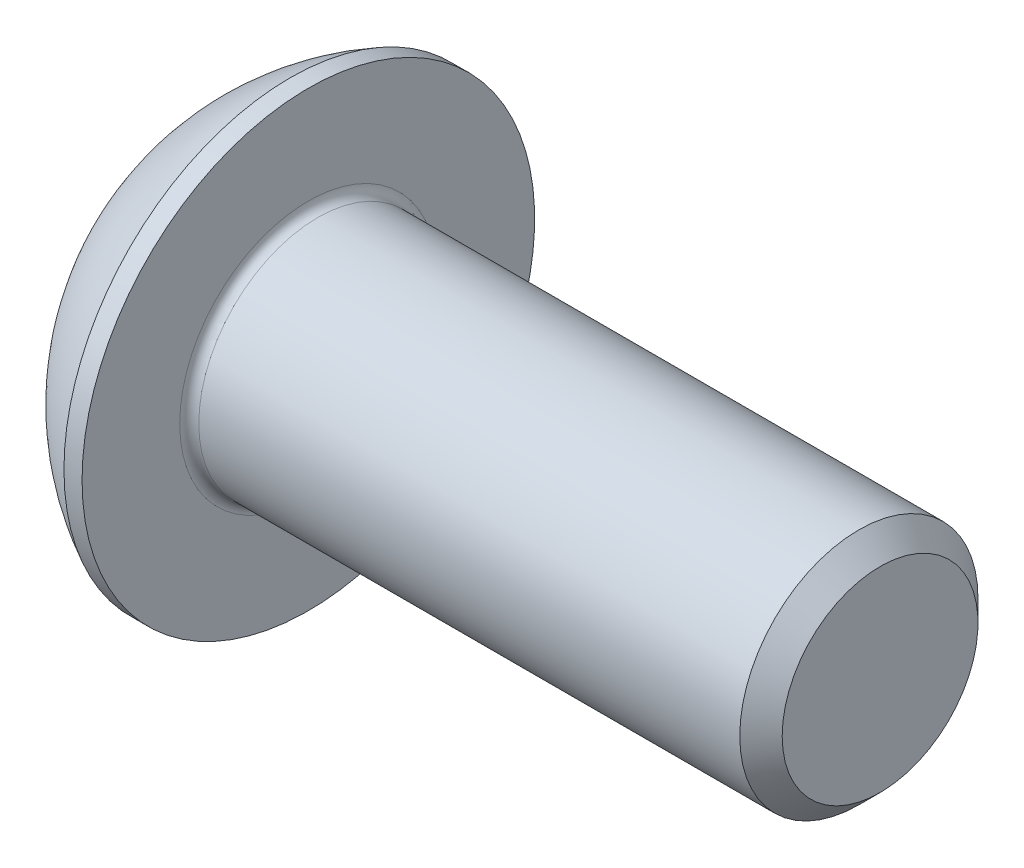
ISO-10303-21;
HEADER;
FILE_DESCRIPTION(('STEP AP214'),'2;1');
FILE_NAME('part.step','',(''),(''),'','','');
FILE_SCHEMA(('AUTOMOTIVE_DESIGN { 1 0 10303 214 1 1 1 1 }'));
ENDSEC;
DATA;
#1=APPLICATION_CONTEXT('core data for automotive mechanical design processes');
#2=APPLICATION_PROTOCOL_DEFINITION('international standard','automotive_design',2000,#1);
#3=PRODUCT_CONTEXT('',#1,'mechanical');
#4=PRODUCT('Part','Part','',(#3));
#5=PRODUCT_RELATED_PRODUCT_CATEGORY('part','',(#4));
#6=PRODUCT_DEFINITION_FORMATION('','',#4);
#7=PRODUCT_DEFINITION_CONTEXT('part definition',#1,'design');
#8=PRODUCT_DEFINITION('design','',#6,#7);
#9=PRODUCT_DEFINITION_SHAPE('','',#8);
#10=(LENGTH_UNIT() NAMED_UNIT(*) SI_UNIT(.MILLI.,.METRE.));
#11=(NAMED_UNIT(*) PLANE_ANGLE_UNIT() SI_UNIT($,.RADIAN.));
#12=(NAMED_UNIT(*) SI_UNIT($,.STERADIAN.) SOLID_ANGLE_UNIT());
#13=UNCERTAINTY_MEASURE_WITH_UNIT(LENGTH_MEASURE(1.E-05),#10,'distance_accuracy_value','');
#14=(GEOMETRIC_REPRESENTATION_CONTEXT(3) GLOBAL_UNCERTAINTY_ASSIGNED_CONTEXT((#13)) GLOBAL_UNIT_ASSIGNED_CONTEXT((#10,
#11,#12)) REPRESENTATION_CONTEXT('',''));
#15=CARTESIAN_POINT('',(0.,0.,0.));
#16=DIRECTION('',(0.,0.,1.));
#17=DIRECTION('',(1.,0.,0.));
#18=AXIS2_PLACEMENT_3D('',#15,#16,#17);
#19=CARTESIAN_POINT('',(0.,0.,0.));
#20=DIRECTION('',(-1.,0.,0.));
#21=DIRECTION('',(0.,0.,1.));
#22=AXIS2_PLACEMENT_3D('',#19,#20,#21);
#23=PLANE('',#22);
#24=CARTESIAN_POINT('',(0.,0.,0.));
#25=DIRECTION('',(-1.,0.,0.));
#26=DIRECTION('',(0.,0.,1.));
#27=AXIS2_PLACEMENT_3D('',#24,#25,#26);
#28=CIRCLE('',#27,2.375);
#29=CARTESIAN_POINT('',(0.,2.375,0.));
#30=VERTEX_POINT('',#29);
#31=EDGE_CURVE('E157',#30,#30,#28,.T.);
#32=ORIENTED_EDGE('',*,*,#31,.T.);
#33=EDGE_LOOP('',(#32));
#34=FACE_BOUND('',#33,.T.);
#35=DIRECTION('',(0.,-1.,0.));
#36=VECTOR('',#35,1.);
#37=CARTESIAN_POINT('',(0.,-0.866025403784438,1.5));
#38=LINE('',#37,#36);
#39=CARTESIAN_POINT('',(0.,0.866025403784439,1.5));
#40=VERTEX_POINT('',#39);
#41=CARTESIAN_POINT('',(0.,-0.866025403784438,1.5));
#42=VERTEX_POINT('',#41);
#43=EDGE_CURVE('E52',#40,#42,#38,.T.);
#44=ORIENTED_EDGE('',*,*,#43,.T.);
#45=DIRECTION('',(0.,-0.500000000000001,-0.866025403784438));
#46=VECTOR('',#45,1.);
#47=CARTESIAN_POINT('',(0.,-1.73205080756888,0.));
#48=LINE('',#47,#46);
#49=CARTESIAN_POINT('',(0.,-1.73205080756888,0.));
#50=VERTEX_POINT('',#49);
#51=EDGE_CURVE('E277',#42,#50,#48,.T.);
#52=ORIENTED_EDGE('',*,*,#51,.T.);
#53=DIRECTION('',(0.,0.500000000000001,-0.866025403784438));
#54=VECTOR('',#53,1.);
#55=CARTESIAN_POINT('',(0.,-0.866025403784438,-1.5));
#56=LINE('',#55,#54);
#57=CARTESIAN_POINT('',(0.,-0.866025403784438,-1.5));
#58=VERTEX_POINT('',#57);
#59=EDGE_CURVE('E132',#50,#58,#56,.T.);
#60=ORIENTED_EDGE('',*,*,#59,.T.);
#61=DIRECTION('',(0.,1.,0.));
#62=VECTOR('',#61,1.);
#63=CARTESIAN_POINT('',(0.,0.866025403784439,-1.5));
#64=LINE('',#63,#62);
#65=CARTESIAN_POINT('',(0.,0.866025403784439,-1.5));
#66=VERTEX_POINT('',#65);
#67=EDGE_CURVE('E280',#58,#66,#64,.T.);
#68=ORIENTED_EDGE('',*,*,#67,.T.);
#69=DIRECTION('',(0.,0.5,0.866025403784439));
#70=VECTOR('',#69,1.);
#71=CARTESIAN_POINT('',(0.,1.73205080756888,0.));
#72=LINE('',#71,#70);
#73=CARTESIAN_POINT('',(0.,1.73205080756888,0.));
#74=VERTEX_POINT('',#73);
#75=EDGE_CURVE('E282',#66,#74,#72,.T.);
#76=ORIENTED_EDGE('',*,*,#75,.T.);
#77=DIRECTION('',(0.,-0.5,0.866025403784439));
#78=VECTOR('',#77,1.);
#79=CARTESIAN_POINT('',(0.,0.866025403784439,1.5));
#80=LINE('',#79,#78);
#81=EDGE_CURVE('E284',#74,#40,#80,.T.);
#82=ORIENTED_EDGE('',*,*,#81,.T.);
#83=EDGE_LOOP('',(#44,#52,#60,#68,#76,#82));
#84=FACE_BOUND('',#83,.T.);
#85=ADVANCED_FACE('F37',(#34,#84),#23,.T.);
#86=CARTESIAN_POINT('',(4.75501582278481,0.,0.));
#87=DIRECTION('',(-1.,0.,0.));
#88=DIRECTION('',(0.,1.,0.));
#89=AXIS2_PLACEMENT_3D('',#86,#87,#88);
#90=SPHERICAL_SURFACE('',#89,5.3151482081814);
#91=CARTESIAN_POINT('',(2.37,0.,0.));
#92=DIRECTION('',(-1.,0.,0.));
#93=DIRECTION('',(0.,0.,1.));
#94=AXIS2_PLACEMENT_3D('',#91,#92,#93);
#95=CIRCLE('',#94,4.75);
#96=CARTESIAN_POINT('',(2.37,4.75,0.));
#97=VERTEX_POINT('',#96);
#98=EDGE_CURVE('E154',#97,#97,#95,.T.);
#99=CARTESIAN_POINT('',(2.37,4.75,0.));
#100=CARTESIAN_POINT('',(2.33822259048669,4.73404434732511,0.));
#101=CARTESIAN_POINT('',(2.30660534291523,4.71776971995817,0.));
#102=CARTESIAN_POINT('',(2.24370380094997,4.68458927158339,0.));
#103=CARTESIAN_POINT('',(2.21241950655618,4.66768345057555,0.));
#104=CARTESIAN_POINT('',(2.15019650024021,4.6332473706621,0.));
#105=CARTESIAN_POINT('',(2.11925778831804,4.6157171117565,0.));
#106=CARTESIAN_POINT('',(2.05773840110808,4.58003923142985,0.));
#107=CARTESIAN_POINT('',(2.02715772582028,4.56189161000879,0.));
#108=CARTESIAN_POINT('',(1.96636673145741,4.52498631044657,0.));
#109=CARTESIAN_POINT('',(1.93615641238234,4.50622863230542,0.));
#110=CARTESIAN_POINT('',(1.87611829826807,4.46811077571318,0.));
#111=CARTESIAN_POINT('',(1.84629050322887,4.4487505972621,0.));
#112=CARTESIAN_POINT('',(1.78702945162455,4.40943553782984,0.));
#113=CARTESIAN_POINT('',(1.75759619505941,4.38948065684866,0.));
#114=CARTESIAN_POINT('',(1.69913607574061,4.34898423002648,0.));
#115=CARTESIAN_POINT('',(1.67010921298694,4.32844268418549,0.));
#116=CARTESIAN_POINT('',(1.61247357298735,4.28678120152175,0.));
#117=CARTESIAN_POINT('',(1.58386479574144,4.265661264699,0.));
#118=CARTESIAN_POINT('',(1.52707685004032,4.22285150694424,0.));
#119=CARTESIAN_POINT('',(1.49889768158512,4.20116168601223,0.));
#120=CARTESIAN_POINT('',(1.44298030371049,4.15722089644741,0.));
#121=CARTESIAN_POINT('',(1.41524209429107,4.13496992781461,0.));
#122=CARTESIAN_POINT('',(1.36021780711889,4.08991580528235,0.));
#123=CARTESIAN_POINT('',(1.33293172936613,4.06711265138288,0.));
#124=CARTESIAN_POINT('',(1.278822696045,4.02096334316478,0.));
#125=CARTESIAN_POINT('',(1.25199974047662,3.99761718884614,0.));
#126=CARTESIAN_POINT('',(1.19882775550162,3.95039128335163,0.));
#127=CARTESIAN_POINT('',(1.172478726095,3.92651153217576,0.));
#128=CARTESIAN_POINT('',(1.1202652065289,3.87822805145535,0.));
#129=CARTESIAN_POINT('',(1.09440071636942,3.85382432191081,0.));
#130=CARTESIAN_POINT('',(1.04316669321618,3.8045027139941,0.));
#131=CARTESIAN_POINT('',(1.01779716022241,3.77958483562192,0.));
#132=CARTESIAN_POINT('',(0.9675632699561,3.72924496668416,0.));
#133=CARTESIAN_POINT('',(0.942698912683562,3.70382297611859,0.));
#134=CARTESIAN_POINT('',(0.893485388936279,3.65248512247887,0.));
#135=CARTESIAN_POINT('',(0.869136222461535,3.62656925940472,0.));
#136=CARTESIAN_POINT('',(0.820962887873489,3.57425409935885,0.));
#137=CARTESIAN_POINT('',(0.797138719760188,3.54785480238711,0.));
#138=CARTESIAN_POINT('',(0.750024977995378,3.49458340787865,0.));
#139=CARTESIAN_POINT('',(0.726735404343869,3.46771131034191,0.));
#140=CARTESIAN_POINT('',(0.68070023227454,3.41350513847464,0.));
#141=CARTESIAN_POINT('',(0.657954633856721,3.3861710641441,0.));
#142=CARTESIAN_POINT('',(0.613016573919582,3.33105194853939,0.));
#143=CARTESIAN_POINT('',(0.590824112400263,3.30326690726522,0.));
#144=CARTESIAN_POINT('',(0.547001265128254,3.24725704926748,0.));
#145=CARTESIAN_POINT('',(0.525370879375564,3.21903223254391,0.));
#146=CARTESIAN_POINT('',(0.482680896105488,3.16215419227902,0.));
#147=CARTESIAN_POINT('',(0.461621298588104,3.13350096873769,0.));
#148=CARTESIAN_POINT('',(0.420081374357153,3.07577765602273,0.));
#149=CARTESIAN_POINT('',(0.399601047643587,3.04670756684908,0.));
#150=CARTESIAN_POINT('',(0.359227914239947,2.98816223197683,0.));
#151=CARTESIAN_POINT('',(0.339335107549873,2.95868698627822,0.));
#152=CARTESIAN_POINT('',(0.300145026860787,2.89934321060632,0.));
#153=CARTESIAN_POINT('',(0.280847752861776,2.86947468063304,0.));
#154=CARTESIAN_POINT('',(0.24285650999714,2.80935636725696,0.));
#155=CARTESIAN_POINT('',(0.224162541131515,2.77910658385417,0.));
#156=CARTESIAN_POINT('',(0.187385439283607,2.71823794734018,0.));
#157=CARTESIAN_POINT('',(0.169302306301324,2.68761909422898,0.));
#158=CARTESIAN_POINT('',(0.133754156035988,2.626024653246,0.));
#159=CARTESIAN_POINT('',(0.116289138752934,2.59504906537422,0.));
#160=CARTESIAN_POINT('',(0.081984269005742,2.53275362391635,0.));
#161=CARTESIAN_POINT('',(0.0651444165416036,2.50143377033028,0.));
#162=CARTESIAN_POINT('',(0.0320966055444289,2.43846244094735,0.));
#163=CARTESIAN_POINT('',(0.0158886470113927,2.40681096515049,0.));
#164=CARTESIAN_POINT('',(0.,2.375,0.));
#165=B_SPLINE_CURVE_WITH_KNOTS('',3,(#99,#100,#101,#102,#103,#104,#105,#106,#107,#108,#109,#110,
#111,#112,#113,#114,#115,#116,#117,#118,#119,#120,#121,#122,#123,#124,#125,#126,#127,#128,#129,
#130,#131,#132,#133,#134,#135,#136,#137,#138,#139,#140,#141,#142,#143,#144,#145,#146,#147,#148,
#149,#150,#151,#152,#153,#154,#155,#156,#157,#158,#159,#160,#161,#162,#163,#164),.UNSPECIFIED.,
.F.,.F.,(4,2,2,2,2,2,2,2,2,2,2,2,2,2,2,2,2,2,2,2,2,2,2,2,2,2,2,2,2,2,2,2,4),(0.,
0.106672849678272,0.213345699356545,0.320018549034817,0.42669139871309,0.533364248391363,
0.640037098069635,0.746709947747908,0.85338279742618,0.960055647104452,1.06672849678273,
1.173401346461,1.28007419613927,1.38674704581754,1.49341989549582,1.60009274517409,
1.70676559485236,1.81343844453063,1.9201112942089,2.02678414388718,2.13345699356545,
2.24012984324372,2.346802692922,2.45347554260027,2.56014839227854,2.66682124195681,
2.77349409163509,2.88016694131336,2.98683979099163,3.0935126406699,3.20018549034817,
3.30685834002645,3.41353118970472),.UNSPECIFIED.);
#166=EDGE_CURVE('BSEAM178',#97,#30,#165,.T.);
#167=ORIENTED_EDGE('',*,*,#98,.T.);
#168=ORIENTED_EDGE('',*,*,#31,.F.);
#169=ORIENTED_EDGE('',*,*,#166,.T.);
#170=ORIENTED_EDGE('',*,*,#166,.F.);
#171=EDGE_LOOP('',(#167,#169,#168,#170));
#172=FACE_BOUND('',#171,.T.);
#173=ADVANCED_FACE('F178',(#172),#90,.T.);
#174=CARTESIAN_POINT('',(0.,0.,0.));
#175=DIRECTION('',(-1.,0.,0.));
#176=DIRECTION('',(0.,0.,1.));
#177=AXIS2_PLACEMENT_3D('',#174,#175,#176);
#178=CYLINDRICAL_SURFACE('',#177,4.75);
#179=ORIENTED_EDGE('',*,*,#98,.F.);
#180=EDGE_LOOP('',(#179));
#181=FACE_BOUND('',#180,.T.);
#182=CARTESIAN_POINT('',(2.75,0.,0.));
#183=DIRECTION('',(-1.,0.,0.));
#184=DIRECTION('',(0.,0.,1.));
#185=AXIS2_PLACEMENT_3D('',#182,#183,#184);
#186=CIRCLE('',#185,4.75);
#187=CARTESIAN_POINT('',(2.75,0.,4.75));
#188=VERTEX_POINT('',#187);
#189=EDGE_CURVE('E151',#188,#188,#186,.T.);
#190=ORIENTED_EDGE('',*,*,#189,.T.);
#191=EDGE_LOOP('',(#190));
#192=FACE_BOUND('',#191,.T.);
#193=ADVANCED_FACE('F183',(#181,#192),#178,.T.);
#194=CARTESIAN_POINT('',(2.75,2.5,0.));
#195=DIRECTION('',(-1.,0.,0.));
#196=DIRECTION('',(0.,0.,1.));
#197=AXIS2_PLACEMENT_3D('',#194,#195,#196);
#198=PLANE('',#197);
#199=CARTESIAN_POINT('',(2.75,0.,0.));
#200=DIRECTION('',(-1.,0.,0.));
#201=DIRECTION('',(0.,0.,1.));
#202=AXIS2_PLACEMENT_3D('',#199,#200,#201);
#203=CIRCLE('',#202,2.7);
#204=CARTESIAN_POINT('',(2.75,0.,2.7));
#205=VERTEX_POINT('',#204);
#206=EDGE_CURVE('E45',#205,#205,#203,.T.);
#207=ORIENTED_EDGE('',*,*,#206,.T.);
#208=EDGE_LOOP('',(#207));
#209=FACE_BOUND('',#208,.T.);
#210=ORIENTED_EDGE('',*,*,#189,.F.);
#211=EDGE_LOOP('',(#210));
#212=FACE_BOUND('',#211,.T.);
#213=ADVANCED_FACE('F162',(#209,#212),#198,.F.);
#214=CARTESIAN_POINT('',(0.,0.,0.));
#215=DIRECTION('',(-1.,0.,0.));
#216=DIRECTION('',(0.,0.,1.));
#217=AXIS2_PLACEMENT_3D('',#214,#215,#216);
#218=CYLINDRICAL_SURFACE('',#217,2.5);
#219=CARTESIAN_POINT('',(2.95,0.,0.));
#220=DIRECTION('',(-1.,0.,0.));
#221=DIRECTION('',(0.,0.,1.));
#222=AXIS2_PLACEMENT_3D('',#219,#220,#221);
#223=CIRCLE('',#222,2.5);
#224=CARTESIAN_POINT('',(2.95,0.,2.5));
#225=VERTEX_POINT('',#224);
#226=EDGE_CURVE('E11',#225,#225,#223,.F.);
#227=ORIENTED_EDGE('',*,*,#226,.T.);
#228=EDGE_LOOP('',(#227));
#229=FACE_BOUND('',#228,.T.);
#230=CARTESIAN_POINT('',(14.305,0.,0.));
#231=DIRECTION('',(-1.,0.,0.));
#232=DIRECTION('',(0.,0.,1.));
#233=AXIS2_PLACEMENT_3D('',#230,#231,#232);
#234=CIRCLE('',#233,2.5);
#235=CARTESIAN_POINT('',(14.305,0.,2.5));
#236=VERTEX_POINT('',#235);
#237=EDGE_CURVE('E148',#236,#236,#234,.T.);
#238=ORIENTED_EDGE('',*,*,#237,.T.);
#239=EDGE_LOOP('',(#238));
#240=FACE_BOUND('',#239,.T.);
#241=ADVANCED_FACE('F192',(#229,#240),#218,.T.);
#242=CARTESIAN_POINT('',(14.75,0.,0.));
#243=DIRECTION('',(-1.,0.,0.));
#244=DIRECTION('',(0.,0.,1.));
#245=AXIS2_PLACEMENT_3D('',#242,#243,#244);
#246=CONICAL_SURFACE('',#245,2.055,0.785398163397445);
#247=ORIENTED_EDGE('',*,*,#237,.F.);
#248=EDGE_LOOP('',(#247));
#249=FACE_BOUND('',#248,.T.);
#250=CARTESIAN_POINT('',(14.75,0.,0.));
#251=DIRECTION('',(-1.,0.,0.));
#252=DIRECTION('',(0.,0.,1.));
#253=AXIS2_PLACEMENT_3D('',#250,#251,#252);
#254=CIRCLE('',#253,2.055);
#255=CARTESIAN_POINT('',(14.75,0.,2.055));
#256=VERTEX_POINT('',#255);
#257=EDGE_CURVE('E144',#256,#256,#254,.T.);
#258=ORIENTED_EDGE('',*,*,#257,.T.);
#259=EDGE_LOOP('',(#258));
#260=FACE_BOUND('',#259,.T.);
#261=ADVANCED_FACE('F173',(#249,#260),#246,.T.);
#262=CARTESIAN_POINT('',(14.75,0.,0.));
#263=DIRECTION('',(-1.,0.,0.));
#264=DIRECTION('',(0.,0.,1.));
#265=AXIS2_PLACEMENT_3D('',#262,#263,#264);
#266=PLANE('',#265);
#267=ORIENTED_EDGE('',*,*,#257,.F.);
#268=EDGE_LOOP('',(#267));
#269=FACE_BOUND('',#268,.T.);
#270=ADVANCED_FACE('F166',(#269),#266,.F.);
#271=CARTESIAN_POINT('',(2.95,0.,0.));
#272=DIRECTION('',(-1.,0.,0.));
#273=DIRECTION('',(0.,0.,1.));
#274=AXIS2_PLACEMENT_3D('',#271,#272,#273);
#275=TOROIDAL_SURFACE('',#274,2.7,0.2);
#276=ORIENTED_EDGE('',*,*,#226,.F.);
#277=EDGE_LOOP('',(#276));
#278=FACE_BOUND('',#277,.T.);
#279=ORIENTED_EDGE('',*,*,#206,.F.);
#280=EDGE_LOOP('',(#279));
#281=FACE_BOUND('',#280,.T.);
#282=ADVANCED_FACE('F39',(#278,#281),#275,.F.);
#283=CARTESIAN_POINT('',(1.56,-1.73205080756888,0.));
#284=DIRECTION('',(0.,0.866025403784438,-0.500000000000001));
#285=DIRECTION('',(0.,0.500000000000001,0.866025403784438));
#286=AXIS2_PLACEMENT_3D('',#283,#284,#285);
#287=PLANE('',#286);
#288=DIRECTION('',(0.,-0.500000000000001,-0.866025403784438));
#289=VECTOR('',#288,1.);
#290=CARTESIAN_POINT('',(1.56,-1.73205080756888,0.));
#291=LINE('',#290,#289);
#292=CARTESIAN_POINT('',(1.56,-0.866025403784438,1.5));
#293=VERTEX_POINT('',#292);
#294=CARTESIAN_POINT('',(1.56,-1.29903810567666,0.750000000000002));
#295=VERTEX_POINT('',#294);
#296=EDGE_CURVE('E118',#293,#295,#291,.T.);
#297=ORIENTED_EDGE('',*,*,#296,.T.);
#298=CARTESIAN_POINT('',(1.56,-1.73205080756888,0.));
#299=VERTEX_POINT('',#298);
#300=EDGE_CURVE('E113',#295,#299,#291,.T.);
#301=ORIENTED_EDGE('',*,*,#300,.T.);
#302=DIRECTION('',(-1.,0.,0.));
#303=VECTOR('',#302,1.);
#304=CARTESIAN_POINT('',(1.56,-1.73205080756888,0.));
#305=LINE('',#304,#303);
#306=EDGE_CURVE('E115',#299,#50,#305,.T.);
#307=ORIENTED_EDGE('',*,*,#306,.T.);
#308=ORIENTED_EDGE('',*,*,#51,.F.);
#309=DIRECTION('',(-1.,0.,0.));
#310=VECTOR('',#309,1.);
#311=CARTESIAN_POINT('',(1.56,-0.866025403784438,1.5));
#312=LINE('',#311,#310);
#313=EDGE_CURVE('E273',#293,#42,#312,.T.);
#314=ORIENTED_EDGE('',*,*,#313,.F.);
#315=EDGE_LOOP('',(#297,#301,#307,#308,#314));
#316=FACE_BOUND('',#315,.T.);
#317=ADVANCED_FACE('F114',(#316),#287,.T.);
#318=CARTESIAN_POINT('',(1.56,-0.866025403784438,-1.5));
#319=DIRECTION('',(0.,0.866025403784438,0.500000000000001));
#320=DIRECTION('',(0.,-0.500000000000001,0.866025403784438));
#321=AXIS2_PLACEMENT_3D('',#318,#319,#320);
#322=PLANE('',#321);
#323=DIRECTION('',(0.,0.500000000000001,-0.866025403784438));
#324=VECTOR('',#323,1.);
#325=CARTESIAN_POINT('',(1.56,-0.866025403784438,-1.5));
#326=LINE('',#325,#324);
#327=CARTESIAN_POINT('',(1.56,-1.29903810567666,-0.750000000000001));
#328=VERTEX_POINT('',#327);
#329=EDGE_CURVE('E60',#299,#328,#326,.T.);
#330=ORIENTED_EDGE('',*,*,#329,.T.);
#331=CARTESIAN_POINT('',(1.56,-0.866025403784438,-1.5));
#332=VERTEX_POINT('',#331);
#333=EDGE_CURVE('E127',#328,#332,#326,.T.);
#334=ORIENTED_EDGE('',*,*,#333,.T.);
#335=DIRECTION('',(-1.,0.,0.));
#336=VECTOR('',#335,1.);
#337=CARTESIAN_POINT('',(1.56,-0.866025403784438,-1.5));
#338=LINE('',#337,#336);
#339=EDGE_CURVE('E134',#332,#58,#338,.T.);
#340=ORIENTED_EDGE('',*,*,#339,.T.);
#341=ORIENTED_EDGE('',*,*,#59,.F.);
#342=ORIENTED_EDGE('',*,*,#306,.F.);
#343=EDGE_LOOP('',(#330,#334,#340,#341,#342));
#344=FACE_BOUND('',#343,.T.);
#345=ADVANCED_FACE('F130',(#344),#322,.T.);
#346=CARTESIAN_POINT('',(1.56,0.866025403784439,-1.5));
#347=DIRECTION('',(0.,0.,1.));
#348=DIRECTION('',(1.,0.,0.));
#349=AXIS2_PLACEMENT_3D('',#346,#347,#348);
#350=PLANE('',#349);
#351=DIRECTION('',(0.,1.,0.));
#352=VECTOR('',#351,1.);
#353=CARTESIAN_POINT('',(1.56,0.866025403784439,-1.5));
#354=LINE('',#353,#352);
#355=CARTESIAN_POINT('',(1.56,0.,-1.5));
#356=VERTEX_POINT('',#355);
#357=EDGE_CURVE('E254',#332,#356,#354,.T.);
#358=ORIENTED_EDGE('',*,*,#357,.T.);
#359=CARTESIAN_POINT('',(1.56,0.866025403784439,-1.5));
#360=VERTEX_POINT('',#359);
#361=EDGE_CURVE('E126',#356,#360,#354,.T.);
#362=ORIENTED_EDGE('',*,*,#361,.T.);
#363=DIRECTION('',(-1.,0.,0.));
#364=VECTOR('',#363,1.);
#365=CARTESIAN_POINT('',(1.56,0.866025403784439,-1.5));
#366=LINE('',#365,#364);
#367=EDGE_CURVE('E139',#360,#66,#366,.T.);
#368=ORIENTED_EDGE('',*,*,#367,.T.);
#369=ORIENTED_EDGE('',*,*,#67,.F.);
#370=ORIENTED_EDGE('',*,*,#339,.F.);
#371=EDGE_LOOP('',(#358,#362,#368,#369,#370));
#372=FACE_BOUND('',#371,.T.);
#373=ADVANCED_FACE('F206',(#372),#350,.T.);
#374=CARTESIAN_POINT('',(1.56,1.73205080756888,0.));
#375=DIRECTION('',(0.,-0.866025403784439,0.5));
#376=DIRECTION('',(0.,-0.5,-0.866025403784439));
#377=AXIS2_PLACEMENT_3D('',#374,#375,#376);
#378=PLANE('',#377);
#379=DIRECTION('',(0.,0.5,0.866025403784439));
#380=VECTOR('',#379,1.);
#381=CARTESIAN_POINT('',(1.56,1.73205080756888,0.));
#382=LINE('',#381,#380);
#383=CARTESIAN_POINT('',(1.56,1.29903810567666,-0.75));
#384=VERTEX_POINT('',#383);
#385=EDGE_CURVE('E243',#360,#384,#382,.T.);
#386=ORIENTED_EDGE('',*,*,#385,.T.);
#387=CARTESIAN_POINT('',(1.56,1.73205080756888,0.));
#388=VERTEX_POINT('',#387);
#389=EDGE_CURVE('E248',#384,#388,#382,.T.);
#390=ORIENTED_EDGE('',*,*,#389,.T.);
#391=DIRECTION('',(-1.,0.,0.));
#392=VECTOR('',#391,1.);
#393=CARTESIAN_POINT('',(1.56,1.73205080756888,0.));
#394=LINE('',#393,#392);
#395=EDGE_CURVE('E288',#388,#74,#394,.T.);
#396=ORIENTED_EDGE('',*,*,#395,.T.);
#397=ORIENTED_EDGE('',*,*,#75,.F.);
#398=ORIENTED_EDGE('',*,*,#367,.F.);
#399=EDGE_LOOP('',(#386,#390,#396,#397,#398));
#400=FACE_BOUND('',#399,.T.);
#401=ADVANCED_FACE('F209',(#400),#378,.T.);
#402=CARTESIAN_POINT('',(1.56,0.866025403784439,1.5));
#403=DIRECTION('',(0.,-0.866025403784439,-0.5));
#404=DIRECTION('',(0.,0.5,-0.866025403784439));
#405=AXIS2_PLACEMENT_3D('',#402,#403,#404);
#406=PLANE('',#405);
#407=DIRECTION('',(0.,-0.5,0.866025403784439));
#408=VECTOR('',#407,1.);
#409=CARTESIAN_POINT('',(1.56,0.866025403784439,1.5));
#410=LINE('',#409,#408);
#411=CARTESIAN_POINT('',(1.56,1.29903810567666,0.75));
#412=VERTEX_POINT('',#411);
#413=EDGE_CURVE('E251',#388,#412,#410,.T.);
#414=ORIENTED_EDGE('',*,*,#413,.T.);
#415=CARTESIAN_POINT('',(1.56,0.866025403784439,1.5));
#416=VERTEX_POINT('',#415);
#417=EDGE_CURVE('E259',#412,#416,#410,.T.);
#418=ORIENTED_EDGE('',*,*,#417,.T.);
#419=DIRECTION('',(-1.,0.,0.));
#420=VECTOR('',#419,1.);
#421=CARTESIAN_POINT('',(1.56,0.866025403784439,1.5));
#422=LINE('',#421,#420);
#423=EDGE_CURVE('E272',#416,#40,#422,.T.);
#424=ORIENTED_EDGE('',*,*,#423,.T.);
#425=ORIENTED_EDGE('',*,*,#81,.F.);
#426=ORIENTED_EDGE('',*,*,#395,.F.);
#427=EDGE_LOOP('',(#414,#418,#424,#425,#426));
#428=FACE_BOUND('',#427,.T.);
#429=ADVANCED_FACE('F213',(#428),#406,.T.);
#430=CARTESIAN_POINT('',(1.56,-0.866025403784438,1.5));
#431=DIRECTION('',(0.,0.,-1.));
#432=DIRECTION('',(-1.,0.,0.));
#433=AXIS2_PLACEMENT_3D('',#430,#431,#432);
#434=PLANE('',#433);
#435=DIRECTION('',(0.,-1.,0.));
#436=VECTOR('',#435,1.);
#437=CARTESIAN_POINT('',(1.56,-0.866025403784438,1.5));
#438=LINE('',#437,#436);
#439=CARTESIAN_POINT('',(1.56,0.,1.5));
#440=VERTEX_POINT('',#439);
#441=EDGE_CURVE('E265',#416,#440,#438,.T.);
#442=ORIENTED_EDGE('',*,*,#441,.T.);
#443=EDGE_CURVE('E267',#440,#293,#438,.T.);
#444=ORIENTED_EDGE('',*,*,#443,.T.);
#445=ORIENTED_EDGE('',*,*,#313,.T.);
#446=ORIENTED_EDGE('',*,*,#43,.F.);
#447=ORIENTED_EDGE('',*,*,#423,.F.);
#448=EDGE_LOOP('',(#442,#444,#445,#446,#447));
#449=FACE_BOUND('',#448,.T.);
#450=ADVANCED_FACE('F217',(#449),#434,.T.);
#451=CARTESIAN_POINT('',(1.56,-1.73205080756888,0.));
#452=DIRECTION('',(1.,0.,0.));
#453=DIRECTION('',(0.,0.,-1.));
#454=AXIS2_PLACEMENT_3D('',#451,#452,#453);
#455=PLANE('',#454);
#456=CARTESIAN_POINT('',(1.56,0.,0.));
#457=DIRECTION('',(-1.,0.,0.));
#458=DIRECTION('',(0.,0.,1.));
#459=AXIS2_PLACEMENT_3D('',#456,#457,#458);
#460=CIRCLE('',#459,1.5);
#461=EDGE_CURVE('E240',#384,#356,#460,.T.);
#462=ORIENTED_EDGE('',*,*,#461,.F.);
#463=ORIENTED_EDGE('',*,*,#385,.F.);
#464=ORIENTED_EDGE('',*,*,#361,.F.);
#465=EDGE_LOOP('',(#462,#463,#464));
#466=FACE_BOUND('',#465,.T.);
#467=ADVANCED_FACE('F221',(#466),#455,.F.);
#468=EDGE_CURVE('E145',#412,#384,#460,.T.);
#469=ORIENTED_EDGE('',*,*,#468,.F.);
#470=ORIENTED_EDGE('',*,*,#413,.F.);
#471=ORIENTED_EDGE('',*,*,#389,.F.);
#472=EDGE_LOOP('',(#469,#470,#471));
#473=FACE_BOUND('',#472,.T.);
#474=ADVANCED_FACE('F230',(#473),#455,.F.);
#475=EDGE_CURVE('E138',#440,#412,#460,.T.);
#476=ORIENTED_EDGE('',*,*,#475,.F.);
#477=ORIENTED_EDGE('',*,*,#441,.F.);
#478=ORIENTED_EDGE('',*,*,#417,.F.);
#479=EDGE_LOOP('',(#476,#477,#478));
#480=FACE_BOUND('',#479,.T.);
#481=ADVANCED_FACE('F235',(#480),#455,.F.);
#482=EDGE_CURVE('E133',#295,#440,#460,.T.);
#483=ORIENTED_EDGE('',*,*,#482,.F.);
#484=ORIENTED_EDGE('',*,*,#296,.F.);
#485=ORIENTED_EDGE('',*,*,#443,.F.);
#486=EDGE_LOOP('',(#483,#484,#485));
#487=FACE_BOUND('',#486,.T.);
#488=ADVANCED_FACE('F228',(#487),#455,.F.);
#489=EDGE_CURVE('E124',#328,#295,#460,.T.);
#490=ORIENTED_EDGE('',*,*,#489,.F.);
#491=ORIENTED_EDGE('',*,*,#329,.F.);
#492=ORIENTED_EDGE('',*,*,#300,.F.);
#493=EDGE_LOOP('',(#490,#491,#492));
#494=FACE_BOUND('',#493,.T.);
#495=ADVANCED_FACE('F123',(#494),#455,.F.);
#496=EDGE_CURVE('E246',#356,#328,#460,.T.);
#497=ORIENTED_EDGE('',*,*,#496,.F.);
#498=ORIENTED_EDGE('',*,*,#357,.F.);
#499=ORIENTED_EDGE('',*,*,#333,.F.);
#500=EDGE_LOOP('',(#497,#498,#499));
#501=FACE_BOUND('',#500,.T.);
#502=ADVANCED_FACE('F201',(#501),#455,.F.);
#503=CARTESIAN_POINT('',(2.42602540378445,0.,0.));
#504=DIRECTION('',(-1.,0.,0.));
#505=DIRECTION('',(0.,0.,1.));
#506=AXIS2_PLACEMENT_3D('',#503,#504,#505);
#507=CONICAL_SURFACE('',#506,0.,1.04719755119659);
#508=ORIENTED_EDGE('',*,*,#475,.T.);
#509=ORIENTED_EDGE('',*,*,#468,.T.);
#510=ORIENTED_EDGE('',*,*,#461,.T.);
#511=ORIENTED_EDGE('',*,*,#496,.T.);
#512=ORIENTED_EDGE('',*,*,#489,.T.);
#513=ORIENTED_EDGE('',*,*,#482,.T.);
#514=EDGE_LOOP('',(#508,#509,#510,#511,#512,#513));
#515=FACE_BOUND('',#514,.T.);
#516=CARTESIAN_POINT('',(2.42602540378445,0.,0.));
#517=VERTEX_POINT('',#516);
#518=VERTEX_LOOP('',#517);
#519=FACE_BOUND('',#518,.T.);
#520=ADVANCED_FACE('F199',(#515,#519),#507,.F.);
#521=CLOSED_SHELL('',(#85,#173,#193,#213,#241,#261,#270,#282,#317,#345,#373,#401,#429,#450,#467,
#474,#481,#488,#495,#502,#520));
#522=MANIFOLD_SOLID_BREP('B2',#521);
#523=ADVANCED_BREP_SHAPE_REPRESENTATION('',(#18,#522),#14);
#524=SHAPE_DEFINITION_REPRESENTATION(#9,#523);
ENDSEC;
END-ISO-10303-21;
